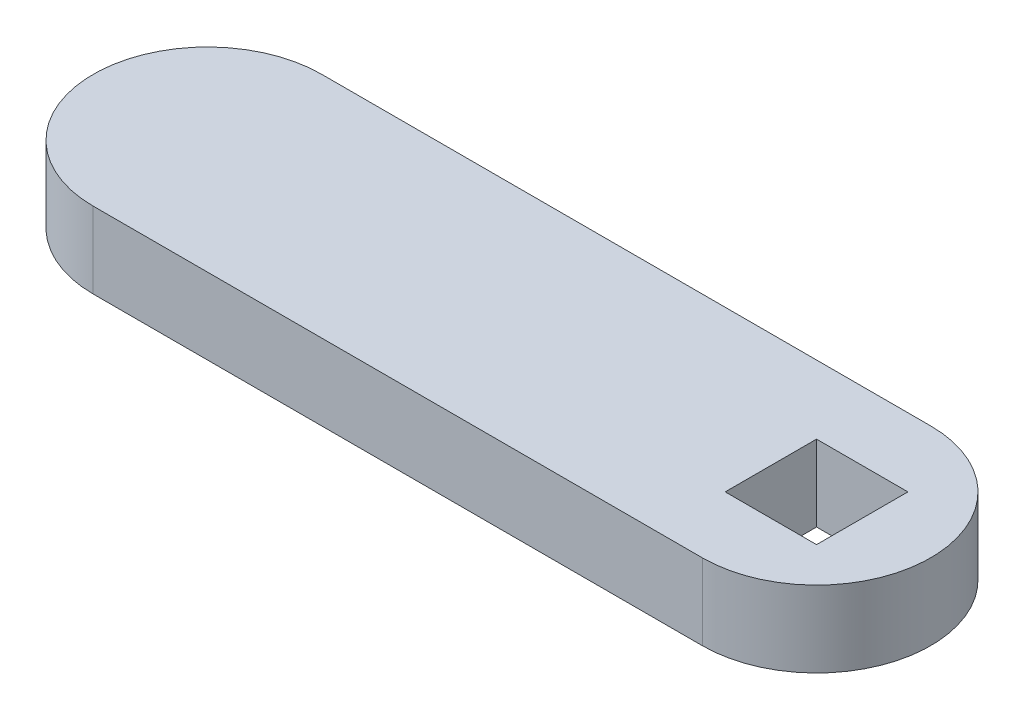
ISO-10303-21;
HEADER;
FILE_DESCRIPTION(('STEP AP214'),'2;1');
FILE_NAME('part.step','',(''),(''),'','','');
FILE_SCHEMA(('AUTOMOTIVE_DESIGN { 1 0 10303 214 1 1 1 1 }'));
ENDSEC;
DATA;
#1=APPLICATION_CONTEXT('core data for automotive mechanical design processes');
#2=APPLICATION_PROTOCOL_DEFINITION('international standard','automotive_design',2000,#1);
#3=PRODUCT_CONTEXT('',#1,'mechanical');
#4=PRODUCT('Part','Part','',(#3));
#5=PRODUCT_RELATED_PRODUCT_CATEGORY('part','',(#4));
#6=PRODUCT_DEFINITION_FORMATION('','',#4);
#7=PRODUCT_DEFINITION_CONTEXT('part definition',#1,'design');
#8=PRODUCT_DEFINITION('design','',#6,#7);
#9=PRODUCT_DEFINITION_SHAPE('','',#8);
#10=(LENGTH_UNIT() NAMED_UNIT(*) SI_UNIT(.MILLI.,.METRE.));
#11=(NAMED_UNIT(*) PLANE_ANGLE_UNIT() SI_UNIT($,.RADIAN.));
#12=(NAMED_UNIT(*) SI_UNIT($,.STERADIAN.) SOLID_ANGLE_UNIT());
#13=UNCERTAINTY_MEASURE_WITH_UNIT(LENGTH_MEASURE(1.E-05),#10,'distance_accuracy_value','');
#14=(GEOMETRIC_REPRESENTATION_CONTEXT(3) GLOBAL_UNCERTAINTY_ASSIGNED_CONTEXT((#13)) GLOBAL_UNIT_ASSIGNED_CONTEXT((#10,
#11,#12)) REPRESENTATION_CONTEXT('',''));
#15=CARTESIAN_POINT('',(0.,0.,0.));
#16=DIRECTION('',(0.,0.,1.));
#17=DIRECTION('',(1.,0.,0.));
#18=AXIS2_PLACEMENT_3D('',#15,#16,#17);
#19=CARTESIAN_POINT('',(0.,50.,0.));
#20=DIRECTION('',(0.,1.,0.));
#21=DIRECTION('',(0.,0.,1.));
#22=AXIS2_PLACEMENT_3D('',#19,#20,#21);
#23=PLANE('',#22);
#24=CARTESIAN_POINT('',(0.,50.,0.));
#25=DIRECTION('',(0.,1.,0.));
#26=DIRECTION('',(0.,0.,1.));
#27=AXIS2_PLACEMENT_3D('',#24,#25,#26);
#28=CIRCLE('',#27,75.);
#29=CARTESIAN_POINT('',(0.,50.,-75.));
#30=VERTEX_POINT('',#29);
#31=CARTESIAN_POINT('',(0.,50.,75.));
#32=VERTEX_POINT('',#31);
#33=EDGE_CURVE('E153',#30,#32,#28,.T.);
#34=ORIENTED_EDGE('',*,*,#33,.T.);
#35=DIRECTION('',(1.,0.,0.));
#36=VECTOR('',#35,1.);
#37=CARTESIAN_POINT('',(0.,50.,75.));
#38=LINE('',#37,#36);
#39=CARTESIAN_POINT('',(400.,50.,75.));
#40=VERTEX_POINT('',#39);
#41=EDGE_CURVE('E157',#32,#40,#38,.T.);
#42=ORIENTED_EDGE('',*,*,#41,.T.);
#43=CARTESIAN_POINT('',(400.,50.,0.));
#44=DIRECTION('',(0.,1.,0.));
#45=DIRECTION('',(0.,0.,1.));
#46=AXIS2_PLACEMENT_3D('',#43,#44,#45);
#47=CIRCLE('',#46,75.);
#48=CARTESIAN_POINT('',(400.,50.,-75.));
#49=VERTEX_POINT('',#48);
#50=EDGE_CURVE('E161',#40,#49,#47,.T.);
#51=ORIENTED_EDGE('',*,*,#50,.T.);
#52=DIRECTION('',(-1.,0.,0.));
#53=VECTOR('',#52,1.);
#54=CARTESIAN_POINT('',(0.,50.,-75.));
#55=LINE('',#54,#53);
#56=EDGE_CURVE('E164',#49,#30,#55,.T.);
#57=ORIENTED_EDGE('',*,*,#56,.T.);
#58=EDGE_LOOP('',(#34,#42,#51,#57));
#59=FACE_BOUND('',#58,.T.);
#60=DIRECTION('',(-1.,0.,0.));
#61=VECTOR('',#60,1.);
#62=CARTESIAN_POINT('',(370.,50.,-30.));
#63=LINE('',#62,#61);
#64=CARTESIAN_POINT('',(430.,50.,-30.));
#65=VERTEX_POINT('',#64);
#66=CARTESIAN_POINT('',(370.,50.,-30.));
#67=VERTEX_POINT('',#66);
#68=EDGE_CURVE('E114',#65,#67,#63,.T.);
#69=ORIENTED_EDGE('',*,*,#68,.F.);
#70=DIRECTION('',(0.,0.,-1.));
#71=VECTOR('',#70,1.);
#72=CARTESIAN_POINT('',(430.,50.,-30.));
#73=LINE('',#72,#71);
#74=CARTESIAN_POINT('',(430.,50.,30.));
#75=VERTEX_POINT('',#74);
#76=EDGE_CURVE('E105',#75,#65,#73,.T.);
#77=ORIENTED_EDGE('',*,*,#76,.F.);
#78=DIRECTION('',(1.,0.,0.));
#79=VECTOR('',#78,1.);
#80=CARTESIAN_POINT('',(370.,50.,30.));
#81=LINE('',#80,#79);
#82=CARTESIAN_POINT('',(370.,50.,30.));
#83=VERTEX_POINT('',#82);
#84=EDGE_CURVE('E131',#83,#75,#81,.T.);
#85=ORIENTED_EDGE('',*,*,#84,.F.);
#86=DIRECTION('',(0.,0.,1.));
#87=VECTOR('',#86,1.);
#88=CARTESIAN_POINT('',(370.,50.,-30.));
#89=LINE('',#88,#87);
#90=EDGE_CURVE('E127',#67,#83,#89,.T.);
#91=ORIENTED_EDGE('',*,*,#90,.F.);
#92=EDGE_LOOP('',(#69,#77,#85,#91));
#93=FACE_BOUND('',#92,.T.);
#94=ADVANCED_FACE('F39',(#59,#93),#23,.T.);
#95=CARTESIAN_POINT('',(0.,0.,0.));
#96=DIRECTION('',(0.,1.,0.));
#97=DIRECTION('',(0.,0.,1.));
#98=AXIS2_PLACEMENT_3D('',#95,#96,#97);
#99=PLANE('',#98);
#100=CARTESIAN_POINT('',(0.,0.,0.));
#101=DIRECTION('',(0.,1.,0.));
#102=DIRECTION('',(0.,0.,1.));
#103=AXIS2_PLACEMENT_3D('',#100,#101,#102);
#104=CIRCLE('',#103,75.);
#105=CARTESIAN_POINT('',(0.,0.,-75.));
#106=VERTEX_POINT('',#105);
#107=CARTESIAN_POINT('',(0.,0.,75.));
#108=VERTEX_POINT('',#107);
#109=EDGE_CURVE('E123',#106,#108,#104,.T.);
#110=ORIENTED_EDGE('',*,*,#109,.F.);
#111=DIRECTION('',(-1.,0.,0.));
#112=VECTOR('',#111,1.);
#113=CARTESIAN_POINT('',(0.,0.,-75.));
#114=LINE('',#113,#112);
#115=CARTESIAN_POINT('',(400.,0.,-75.));
#116=VERTEX_POINT('',#115);
#117=EDGE_CURVE('E158',#116,#106,#114,.T.);
#118=ORIENTED_EDGE('',*,*,#117,.F.);
#119=CARTESIAN_POINT('',(400.,0.,0.));
#120=DIRECTION('',(0.,1.,0.));
#121=DIRECTION('',(0.,0.,1.));
#122=AXIS2_PLACEMENT_3D('',#119,#120,#121);
#123=CIRCLE('',#122,75.);
#124=CARTESIAN_POINT('',(400.,0.,75.));
#125=VERTEX_POINT('',#124);
#126=EDGE_CURVE('E174',#125,#116,#123,.T.);
#127=ORIENTED_EDGE('',*,*,#126,.F.);
#128=DIRECTION('',(1.,0.,0.));
#129=VECTOR('',#128,1.);
#130=CARTESIAN_POINT('',(0.,0.,75.));
#131=LINE('',#130,#129);
#132=EDGE_CURVE('E171',#108,#125,#131,.T.);
#133=ORIENTED_EDGE('',*,*,#132,.F.);
#134=EDGE_LOOP('',(#110,#118,#127,#133));
#135=FACE_BOUND('',#134,.T.);
#136=DIRECTION('',(0.,0.,-1.));
#137=VECTOR('',#136,1.);
#138=CARTESIAN_POINT('',(430.,0.,-30.));
#139=LINE('',#138,#137);
#140=CARTESIAN_POINT('',(430.,0.,30.));
#141=VERTEX_POINT('',#140);
#142=CARTESIAN_POINT('',(430.,0.,-30.));
#143=VERTEX_POINT('',#142);
#144=EDGE_CURVE('E63',#141,#143,#139,.T.);
#145=ORIENTED_EDGE('',*,*,#144,.T.);
#146=DIRECTION('',(-1.,0.,0.));
#147=VECTOR('',#146,1.);
#148=CARTESIAN_POINT('',(370.,0.,-30.));
#149=LINE('',#148,#147);
#150=CARTESIAN_POINT('',(370.,0.,-30.));
#151=VERTEX_POINT('',#150);
#152=EDGE_CURVE('E121',#143,#151,#149,.T.);
#153=ORIENTED_EDGE('',*,*,#152,.T.);
#154=DIRECTION('',(0.,0.,1.));
#155=VECTOR('',#154,1.);
#156=CARTESIAN_POINT('',(370.,0.,-30.));
#157=LINE('',#156,#155);
#158=CARTESIAN_POINT('',(370.,0.,30.));
#159=VERTEX_POINT('',#158);
#160=EDGE_CURVE('E140',#151,#159,#157,.T.);
#161=ORIENTED_EDGE('',*,*,#160,.T.);
#162=DIRECTION('',(1.,0.,0.));
#163=VECTOR('',#162,1.);
#164=CARTESIAN_POINT('',(370.,0.,30.));
#165=LINE('',#164,#163);
#166=EDGE_CURVE('E115',#159,#141,#165,.T.);
#167=ORIENTED_EDGE('',*,*,#166,.T.);
#168=EDGE_LOOP('',(#145,#153,#161,#167));
#169=FACE_BOUND('',#168,.T.);
#170=ADVANCED_FACE('F197',(#135,#169),#99,.F.);
#171=CARTESIAN_POINT('',(0.,50.,0.));
#172=DIRECTION('',(0.,-1.,0.));
#173=DIRECTION('',(0.,0.,-1.));
#174=AXIS2_PLACEMENT_3D('',#171,#172,#173);
#175=CYLINDRICAL_SURFACE('',#174,75.);
#176=ORIENTED_EDGE('',*,*,#109,.T.);
#177=DIRECTION('',(0.,-1.,0.));
#178=VECTOR('',#177,1.);
#179=CARTESIAN_POINT('',(0.,50.,75.));
#180=LINE('',#179,#178);
#181=EDGE_CURVE('E11',#32,#108,#180,.T.);
#182=ORIENTED_EDGE('',*,*,#181,.F.);
#183=ORIENTED_EDGE('',*,*,#33,.F.);
#184=DIRECTION('',(0.,-1.,0.));
#185=VECTOR('',#184,1.);
#186=CARTESIAN_POINT('',(0.,50.,-75.));
#187=LINE('',#186,#185);
#188=EDGE_CURVE('E167',#30,#106,#187,.T.);
#189=ORIENTED_EDGE('',*,*,#188,.T.);
#190=EDGE_LOOP('',(#176,#182,#183,#189));
#191=FACE_BOUND('',#190,.T.);
#192=ADVANCED_FACE('F41',(#191),#175,.T.);
#193=CARTESIAN_POINT('',(0.,50.,75.));
#194=DIRECTION('',(0.,0.,-1.));
#195=DIRECTION('',(-1.,0.,0.));
#196=AXIS2_PLACEMENT_3D('',#193,#194,#195);
#197=PLANE('',#196);
#198=ORIENTED_EDGE('',*,*,#132,.T.);
#199=DIRECTION('',(0.,-1.,0.));
#200=VECTOR('',#199,1.);
#201=CARTESIAN_POINT('',(400.,50.,75.));
#202=LINE('',#201,#200);
#203=EDGE_CURVE('E48',#40,#125,#202,.T.);
#204=ORIENTED_EDGE('',*,*,#203,.F.);
#205=ORIENTED_EDGE('',*,*,#41,.F.);
#206=ORIENTED_EDGE('',*,*,#181,.T.);
#207=EDGE_LOOP('',(#198,#204,#205,#206));
#208=FACE_BOUND('',#207,.T.);
#209=ADVANCED_FACE('F207',(#208),#197,.F.);
#210=CARTESIAN_POINT('',(400.,50.,0.));
#211=DIRECTION('',(0.,-1.,0.));
#212=DIRECTION('',(0.,0.,-1.));
#213=AXIS2_PLACEMENT_3D('',#210,#211,#212);
#214=CYLINDRICAL_SURFACE('',#213,75.);
#215=ORIENTED_EDGE('',*,*,#126,.T.);
#216=DIRECTION('',(0.,-1.,0.));
#217=VECTOR('',#216,1.);
#218=CARTESIAN_POINT('',(400.,50.,-75.));
#219=LINE('',#218,#217);
#220=EDGE_CURVE('E182',#49,#116,#219,.T.);
#221=ORIENTED_EDGE('',*,*,#220,.F.);
#222=ORIENTED_EDGE('',*,*,#50,.F.);
#223=ORIENTED_EDGE('',*,*,#203,.T.);
#224=EDGE_LOOP('',(#215,#221,#222,#223));
#225=FACE_BOUND('',#224,.T.);
#226=ADVANCED_FACE('F191',(#225),#214,.T.);
#227=CARTESIAN_POINT('',(0.,50.,-75.));
#228=DIRECTION('',(0.,0.,1.));
#229=DIRECTION('',(1.,0.,0.));
#230=AXIS2_PLACEMENT_3D('',#227,#228,#229);
#231=PLANE('',#230);
#232=ORIENTED_EDGE('',*,*,#117,.T.);
#233=ORIENTED_EDGE('',*,*,#188,.F.);
#234=ORIENTED_EDGE('',*,*,#56,.F.);
#235=ORIENTED_EDGE('',*,*,#220,.T.);
#236=EDGE_LOOP('',(#232,#233,#234,#235));
#237=FACE_BOUND('',#236,.T.);
#238=ADVANCED_FACE('F201',(#237),#231,.F.);
#239=CARTESIAN_POINT('',(430.,50.,-30.));
#240=DIRECTION('',(-1.,0.,0.));
#241=DIRECTION('',(0.,0.,1.));
#242=AXIS2_PLACEMENT_3D('',#239,#240,#241);
#243=PLANE('',#242);
#244=ORIENTED_EDGE('',*,*,#144,.F.);
#245=DIRECTION('',(0.,-1.,0.));
#246=VECTOR('',#245,1.);
#247=CARTESIAN_POINT('',(430.,50.,30.));
#248=LINE('',#247,#246);
#249=EDGE_CURVE('E109',#75,#141,#248,.T.);
#250=ORIENTED_EDGE('',*,*,#249,.F.);
#251=ORIENTED_EDGE('',*,*,#76,.T.);
#252=DIRECTION('',(0.,-1.,0.));
#253=VECTOR('',#252,1.);
#254=CARTESIAN_POINT('',(430.,50.,-30.));
#255=LINE('',#254,#253);
#256=EDGE_CURVE('E108',#65,#143,#255,.T.);
#257=ORIENTED_EDGE('',*,*,#256,.T.);
#258=EDGE_LOOP('',(#244,#250,#251,#257));
#259=FACE_BOUND('',#258,.T.);
#260=ADVANCED_FACE('F107',(#259),#243,.T.);
#261=CARTESIAN_POINT('',(370.,50.,-30.));
#262=DIRECTION('',(0.,0.,1.));
#263=DIRECTION('',(1.,0.,0.));
#264=AXIS2_PLACEMENT_3D('',#261,#262,#263);
#265=PLANE('',#264);
#266=ORIENTED_EDGE('',*,*,#152,.F.);
#267=ORIENTED_EDGE('',*,*,#256,.F.);
#268=ORIENTED_EDGE('',*,*,#68,.T.);
#269=DIRECTION('',(0.,-1.,0.));
#270=VECTOR('',#269,1.);
#271=CARTESIAN_POINT('',(370.,50.,-30.));
#272=LINE('',#271,#270);
#273=EDGE_CURVE('E124',#67,#151,#272,.T.);
#274=ORIENTED_EDGE('',*,*,#273,.T.);
#275=EDGE_LOOP('',(#266,#267,#268,#274));
#276=FACE_BOUND('',#275,.T.);
#277=ADVANCED_FACE('F118',(#276),#265,.T.);
#278=CARTESIAN_POINT('',(370.,50.,-30.));
#279=DIRECTION('',(1.,0.,0.));
#280=DIRECTION('',(0.,0.,-1.));
#281=AXIS2_PLACEMENT_3D('',#278,#279,#280);
#282=PLANE('',#281);
#283=ORIENTED_EDGE('',*,*,#160,.F.);
#284=ORIENTED_EDGE('',*,*,#273,.F.);
#285=ORIENTED_EDGE('',*,*,#90,.T.);
#286=DIRECTION('',(0.,-1.,0.));
#287=VECTOR('',#286,1.);
#288=CARTESIAN_POINT('',(370.,50.,30.));
#289=LINE('',#288,#287);
#290=EDGE_CURVE('E55',#83,#159,#289,.T.);
#291=ORIENTED_EDGE('',*,*,#290,.T.);
#292=EDGE_LOOP('',(#283,#284,#285,#291));
#293=FACE_BOUND('',#292,.T.);
#294=ADVANCED_FACE('F230',(#293),#282,.T.);
#295=CARTESIAN_POINT('',(370.,50.,30.));
#296=DIRECTION('',(0.,0.,-1.));
#297=DIRECTION('',(-1.,0.,0.));
#298=AXIS2_PLACEMENT_3D('',#295,#296,#297);
#299=PLANE('',#298);
#300=ORIENTED_EDGE('',*,*,#166,.F.);
#301=ORIENTED_EDGE('',*,*,#290,.F.);
#302=ORIENTED_EDGE('',*,*,#84,.T.);
#303=ORIENTED_EDGE('',*,*,#249,.T.);
#304=EDGE_LOOP('',(#300,#301,#302,#303));
#305=FACE_BOUND('',#304,.T.);
#306=ADVANCED_FACE('F234',(#305),#299,.T.);
#307=CLOSED_SHELL('',(#94,#170,#192,#209,#226,#238,#260,#277,#294,#306));
#308=MANIFOLD_SOLID_BREP('B2',#307);
#309=ADVANCED_BREP_SHAPE_REPRESENTATION('',(#18,#308),#14);
#310=SHAPE_DEFINITION_REPRESENTATION(#9,#309);
ENDSEC;
END-ISO-10303-21;
